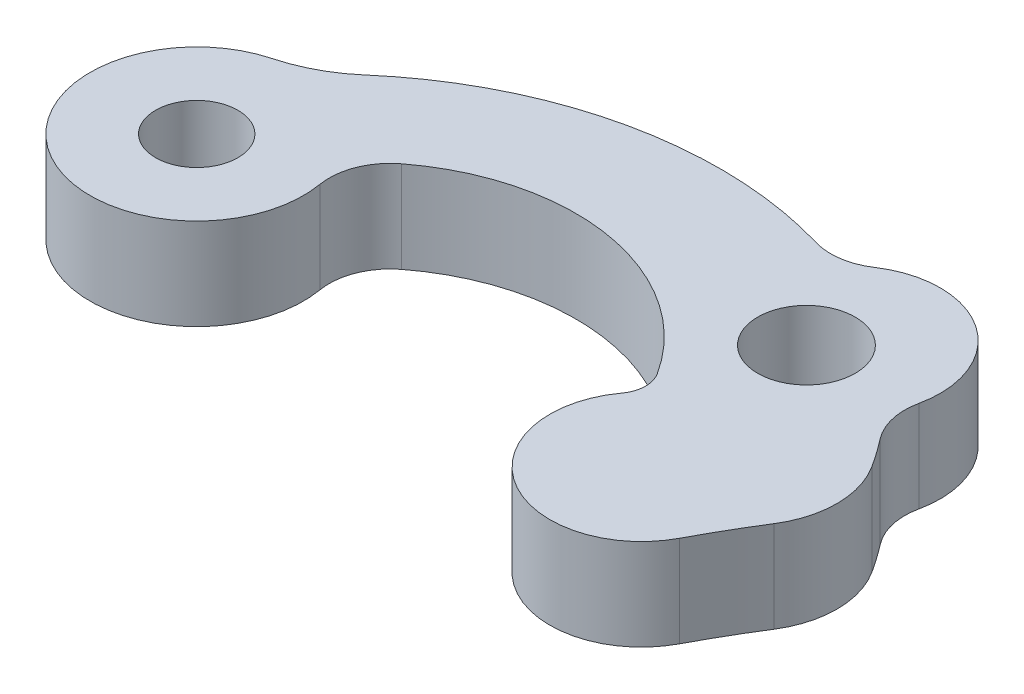
ISO-10303-21;
HEADER;
FILE_DESCRIPTION(('STEP AP214'),'2;1');
FILE_NAME('part.step','',(''),(''),'','','');
FILE_SCHEMA(('AUTOMOTIVE_DESIGN { 1 0 10303 214 1 1 1 1 }'));
ENDSEC;
DATA;
#1=APPLICATION_CONTEXT('core data for automotive mechanical design processes');
#2=APPLICATION_PROTOCOL_DEFINITION('international standard','automotive_design',2000,#1);
#3=PRODUCT_CONTEXT('',#1,'mechanical');
#4=PRODUCT('Part','Part','',(#3));
#5=PRODUCT_RELATED_PRODUCT_CATEGORY('part','',(#4));
#6=PRODUCT_DEFINITION_FORMATION('','',#4);
#7=PRODUCT_DEFINITION_CONTEXT('part definition',#1,'design');
#8=PRODUCT_DEFINITION('design','',#6,#7);
#9=PRODUCT_DEFINITION_SHAPE('','',#8);
#10=(LENGTH_UNIT() NAMED_UNIT(*) SI_UNIT(.MILLI.,.METRE.));
#11=(NAMED_UNIT(*) PLANE_ANGLE_UNIT() SI_UNIT($,.RADIAN.));
#12=(NAMED_UNIT(*) SI_UNIT($,.STERADIAN.) SOLID_ANGLE_UNIT());
#13=UNCERTAINTY_MEASURE_WITH_UNIT(LENGTH_MEASURE(1.E-05),#10,'distance_accuracy_value','');
#14=(GEOMETRIC_REPRESENTATION_CONTEXT(3) GLOBAL_UNCERTAINTY_ASSIGNED_CONTEXT((#13)) GLOBAL_UNIT_ASSIGNED_CONTEXT((#10,
#11,#12)) REPRESENTATION_CONTEXT('',''));
#15=CARTESIAN_POINT('',(0.,0.,0.));
#16=DIRECTION('',(0.,0.,1.));
#17=DIRECTION('',(1.,0.,0.));
#18=AXIS2_PLACEMENT_3D('',#15,#16,#17);
#19=CARTESIAN_POINT('',(9.58333333333333,3.,5.39997427977414));
#20=DIRECTION('',(0.,-1.,0.));
#21=DIRECTION('',(0.,0.,-1.));
#22=AXIS2_PLACEMENT_3D('',#19,#20,#21);
#23=CYLINDRICAL_SURFACE('',#22,13.);
#24=CARTESIAN_POINT('',(9.58333333333333,0.,5.39997427977414));
#25=DIRECTION('',(0.,1.,0.));
#26=DIRECTION('',(0.,0.,1.));
#27=AXIS2_PLACEMENT_3D('',#24,#25,#26);
#28=CIRCLE('',#27,13.);
#29=CARTESIAN_POINT('',(19.8692193431616,0.,-2.54990301442477));
#30=VERTEX_POINT('',#29);
#31=CARTESIAN_POINT('',(20.525,0.,-1.61999228393224));
#32=VERTEX_POINT('',#31);
#33=EDGE_CURVE('E287',#30,#32,#28,.F.);
#34=ORIENTED_EDGE('',*,*,#33,.F.);
#35=DIRECTION('',(0.,-1.,0.));
#36=VECTOR('',#35,1.);
#37=CARTESIAN_POINT('',(19.8692193431616,3.,-2.54990301442477));
#38=LINE('',#37,#36);
#39=CARTESIAN_POINT('',(19.8692193431616,3.,-2.54990301442477));
#40=VERTEX_POINT('',#39);
#41=EDGE_CURVE('E139',#30,#40,#38,.F.);
#42=ORIENTED_EDGE('',*,*,#41,.T.);
#43=CARTESIAN_POINT('',(9.58333333333333,3.,5.39997427977414));
#44=DIRECTION('',(0.,1.,0.));
#45=DIRECTION('',(0.,0.,1.));
#46=AXIS2_PLACEMENT_3D('',#43,#44,#45);
#47=CIRCLE('',#46,13.);
#48=CARTESIAN_POINT('',(20.525,3.,-1.61999228393224));
#49=VERTEX_POINT('',#48);
#50=EDGE_CURVE('E135',#40,#49,#47,.F.);
#51=ORIENTED_EDGE('',*,*,#50,.T.);
#52=DIRECTION('',(0.,-1.,0.));
#53=VECTOR('',#52,1.);
#54=CARTESIAN_POINT('',(20.525,3.,-1.61999228393224));
#55=LINE('',#54,#53);
#56=EDGE_CURVE('E138',#49,#32,#55,.T.);
#57=ORIENTED_EDGE('',*,*,#56,.T.);
#58=EDGE_LOOP('',(#34,#42,#51,#57));
#59=FACE_BOUND('',#58,.T.);
#60=ADVANCED_FACE('F41',(#59),#23,.T.);
#61=CARTESIAN_POINT('',(8.47222222222222,3.,3.03668414842308));
#62=DIRECTION('',(0.,-1.,0.));
#63=DIRECTION('',(0.,0.,-1.));
#64=AXIS2_PLACEMENT_3D('',#61,#62,#63);
#65=CYLINDRICAL_SURFACE('',#64,7.);
#66=CARTESIAN_POINT('',(8.47222222222222,0.,3.03668414842308));
#67=DIRECTION('',(0.,1.,0.));
#68=DIRECTION('',(0.,0.,1.));
#69=AXIS2_PLACEMENT_3D('',#66,#67,#68);
#70=CIRCLE('',#69,7.);
#71=CARTESIAN_POINT('',(4.20145579431538,0.,-2.50953565593591));
#72=VERTEX_POINT('',#71);
#73=CARTESIAN_POINT('',(14.3662242350737,0.,-0.73965538510701));
#74=VERTEX_POINT('',#73);
#75=EDGE_CURVE('E282',#72,#74,#70,.F.);
#76=ORIENTED_EDGE('',*,*,#75,.T.);
#77=DIRECTION('',(0.,-1.,0.));
#78=VECTOR('',#77,1.);
#79=CARTESIAN_POINT('',(14.3662242350737,3.,-0.739655385107009));
#80=LINE('',#79,#78);
#81=CARTESIAN_POINT('',(14.3662242350737,3.,-0.73965538510701));
#82=VERTEX_POINT('',#81);
#83=EDGE_CURVE('E176',#74,#82,#80,.F.);
#84=ORIENTED_EDGE('',*,*,#83,.T.);
#85=CARTESIAN_POINT('',(8.47222222222222,3.,3.03668414842308));
#86=DIRECTION('',(0.,1.,0.));
#87=DIRECTION('',(0.,0.,1.));
#88=AXIS2_PLACEMENT_3D('',#85,#86,#87);
#89=CIRCLE('',#88,7.);
#90=CARTESIAN_POINT('',(4.20145579431538,3.,-2.50953565593591));
#91=VERTEX_POINT('',#90);
#92=EDGE_CURVE('E273',#91,#82,#89,.F.);
#93=ORIENTED_EDGE('',*,*,#92,.F.);
#94=DIRECTION('',(0.,-1.,0.));
#95=VECTOR('',#94,1.);
#96=CARTESIAN_POINT('',(4.20145579431538,3.,-2.50953565593591));
#97=LINE('',#96,#95);
#98=EDGE_CURVE('E173',#91,#72,#97,.T.);
#99=ORIENTED_EDGE('',*,*,#98,.T.);
#100=EDGE_LOOP('',(#76,#84,#93,#99));
#101=FACE_BOUND('',#100,.T.);
#102=ADVANCED_FACE('F227',(#101),#65,.F.);
#103=CARTESIAN_POINT('',(16.75,3.,2.16506350946109));
#104=DIRECTION('',(0.,-1.,0.));
#105=DIRECTION('',(0.,0.,-1.));
#106=AXIS2_PLACEMENT_3D('',#103,#104,#105);
#107=CYLINDRICAL_SURFACE('',#106,3.);
#108=CARTESIAN_POINT('',(16.75,0.,2.16506350946109));
#109=DIRECTION('',(0.,1.,0.));
#110=DIRECTION('',(0.,0.,1.));
#111=AXIS2_PLACEMENT_3D('',#108,#109,#110);
#112=CIRCLE('',#111,3.);
#113=CARTESIAN_POINT('',(14.3306679606426,0.,0.391132145698954));
#114=VERTEX_POINT('',#113);
#115=CARTESIAN_POINT('',(19.4030298609084,0.,3.56557504355433));
#116=VERTEX_POINT('',#115);
#117=EDGE_CURVE('E285',#114,#116,#112,.T.);
#118=ORIENTED_EDGE('',*,*,#117,.T.);
#119=DIRECTION('',(0.,-1.,0.));
#120=VECTOR('',#119,1.);
#121=CARTESIAN_POINT('',(19.4030298609084,3.,3.56557504355433));
#122=LINE('',#121,#120);
#123=CARTESIAN_POINT('',(19.4030298609084,3.,3.56557504355433));
#124=VERTEX_POINT('',#123);
#125=EDGE_CURVE('E171',#116,#124,#122,.F.);
#126=ORIENTED_EDGE('',*,*,#125,.T.);
#127=CARTESIAN_POINT('',(16.75,3.,2.16506350946109));
#128=DIRECTION('',(0.,1.,0.));
#129=DIRECTION('',(0.,0.,1.));
#130=AXIS2_PLACEMENT_3D('',#127,#128,#129);
#131=CIRCLE('',#130,3.);
#132=CARTESIAN_POINT('',(14.3306679606426,3.,0.391132145698954));
#133=VERTEX_POINT('',#132);
#134=EDGE_CURVE('E154',#133,#124,#131,.T.);
#135=ORIENTED_EDGE('',*,*,#134,.F.);
#136=DIRECTION('',(0.,-1.,0.));
#137=VECTOR('',#136,1.);
#138=CARTESIAN_POINT('',(14.3306679606426,3.,0.391132145698954));
#139=LINE('',#138,#137);
#140=EDGE_CURVE('E162',#133,#114,#139,.T.);
#141=ORIENTED_EDGE('',*,*,#140,.T.);
#142=EDGE_LOOP('',(#118,#126,#135,#141));
#143=FACE_BOUND('',#142,.T.);
#144=ADVANCED_FACE('F233',(#143),#107,.T.);
#145=CARTESIAN_POINT('',(18.,3.,0.));
#146=DIRECTION('',(0.,-1.,0.));
#147=DIRECTION('',(0.,0.,-1.));
#148=AXIS2_PLACEMENT_3D('',#145,#146,#147);
#149=CYLINDRICAL_SURFACE('',#148,3.);
#150=CARTESIAN_POINT('',(18.,3.,0.));
#151=DIRECTION('',(0.,1.,0.));
#152=DIRECTION('',(0.,0.,1.));
#153=AXIS2_PLACEMENT_3D('',#150,#151,#152);
#154=CIRCLE('',#153,3.);
#155=CARTESIAN_POINT('',(20.5393934972721,3.,1.59733548949879));
#156=VERTEX_POINT('',#155);
#157=EDGE_CURVE('E142',#156,#49,#154,.T.);
#158=ORIENTED_EDGE('',*,*,#157,.F.);
#159=DIRECTION('',(0.,-1.,0.));
#160=VECTOR('',#159,1.);
#161=CARTESIAN_POINT('',(20.5393934972721,3.,1.59733548949879));
#162=LINE('',#161,#160);
#163=CARTESIAN_POINT('',(20.5393934972721,0.,1.59733548949879));
#164=VERTEX_POINT('',#163);
#165=EDGE_CURVE('E160',#156,#164,#162,.T.);
#166=ORIENTED_EDGE('',*,*,#165,.T.);
#167=CARTESIAN_POINT('',(18.,0.,0.));
#168=DIRECTION('',(0.,1.,0.));
#169=DIRECTION('',(0.,0.,1.));
#170=AXIS2_PLACEMENT_3D('',#167,#168,#169);
#171=CIRCLE('',#170,3.);
#172=EDGE_CURVE('E159',#164,#32,#171,.T.);
#173=ORIENTED_EDGE('',*,*,#172,.T.);
#174=ORIENTED_EDGE('',*,*,#56,.F.);
#175=EDGE_LOOP('',(#158,#166,#173,#174));
#176=FACE_BOUND('',#175,.T.);
#177=ADVANCED_FACE('F157',(#176),#149,.T.);
#178=CARTESIAN_POINT('',(0.,3.,0.));
#179=DIRECTION('',(0.,-1.,0.));
#180=DIRECTION('',(0.,0.,-1.));
#181=AXIS2_PLACEMENT_3D('',#178,#179,#180);
#182=CYLINDRICAL_SURFACE('',#181,1.35);
#183=CARTESIAN_POINT('',(0.,3.,0.));
#184=DIRECTION('',(0.,1.,0.));
#185=DIRECTION('',(0.,0.,1.));
#186=AXIS2_PLACEMENT_3D('',#183,#184,#185);
#187=CIRCLE('',#186,1.35);
#188=CARTESIAN_POINT('',(0.,3.,1.35));
#189=VERTEX_POINT('',#188);
#190=EDGE_CURVE('E270',#189,#189,#187,.T.);
#191=ORIENTED_EDGE('',*,*,#190,.T.);
#192=EDGE_LOOP('',(#191));
#193=FACE_BOUND('',#192,.T.);
#194=CARTESIAN_POINT('',(0.,0.,0.));
#195=DIRECTION('',(0.,1.,0.));
#196=DIRECTION('',(0.,0.,1.));
#197=AXIS2_PLACEMENT_3D('',#194,#195,#196);
#198=CIRCLE('',#197,1.35);
#199=CARTESIAN_POINT('',(0.,0.,1.35));
#200=VERTEX_POINT('',#199);
#201=EDGE_CURVE('E279',#200,#200,#198,.T.);
#202=ORIENTED_EDGE('',*,*,#201,.F.);
#203=EDGE_LOOP('',(#202));
#204=FACE_BOUND('',#203,.T.);
#205=ADVANCED_FACE('F247',(#193,#204),#182,.F.);
#206=CARTESIAN_POINT('',(16.,3.,-4.));
#207=DIRECTION('',(0.,-1.,0.));
#208=DIRECTION('',(0.,0.,-1.));
#209=AXIS2_PLACEMENT_3D('',#206,#207,#208);
#210=CYLINDRICAL_SURFACE('',#209,1.6);
#211=CARTESIAN_POINT('',(16.,3.,-4.));
#212=DIRECTION('',(0.,1.,0.));
#213=DIRECTION('',(0.,0.,1.));
#214=AXIS2_PLACEMENT_3D('',#211,#212,#213);
#215=CIRCLE('',#214,1.6);
#216=CARTESIAN_POINT('',(16.,3.,-2.4));
#217=VERTEX_POINT('',#216);
#218=EDGE_CURVE('E267',#217,#217,#215,.T.);
#219=ORIENTED_EDGE('',*,*,#218,.T.);
#220=EDGE_LOOP('',(#219));
#221=FACE_BOUND('',#220,.T.);
#222=CARTESIAN_POINT('',(16.,0.,-4.));
#223=DIRECTION('',(0.,1.,0.));
#224=DIRECTION('',(0.,0.,1.));
#225=AXIS2_PLACEMENT_3D('',#222,#223,#224);
#226=CIRCLE('',#225,1.6);
#227=CARTESIAN_POINT('',(16.,0.,-2.4));
#228=VERTEX_POINT('',#227);
#229=EDGE_CURVE('E265',#228,#228,#226,.T.);
#230=ORIENTED_EDGE('',*,*,#229,.F.);
#231=EDGE_LOOP('',(#230));
#232=FACE_BOUND('',#231,.T.);
#233=ADVANCED_FACE('F239',(#221,#232),#210,.F.);
#234=CARTESIAN_POINT('',(1.07705841033847,3.,-4.43075748009139));
#235=VERTEX_POINT('',#234);
#236=CARTESIAN_POINT('',(13.2400714875913,3.,-7.07513157433364));
#237=VERTEX_POINT('',#236);
#238=EDGE_CURVE('E141',#235,#237,#47,.F.);
#239=ORIENTED_EDGE('',*,*,#238,.T.);
#240=DIRECTION('',(0.,-1.,0.));
#241=VECTOR('',#240,1.);
#242=CARTESIAN_POINT('',(13.2400714875913,3.,-7.07513157433364));
#243=LINE('',#242,#241);
#244=CARTESIAN_POINT('',(13.2400714875913,0.,-7.07513157433364));
#245=VERTEX_POINT('',#244);
#246=EDGE_CURVE('E205',#237,#245,#243,.T.);
#247=ORIENTED_EDGE('',*,*,#246,.T.);
#248=CARTESIAN_POINT('',(1.07705841033847,0.,-4.43075748009139));
#249=VERTEX_POINT('',#248);
#250=EDGE_CURVE('E166',#249,#245,#28,.F.);
#251=ORIENTED_EDGE('',*,*,#250,.F.);
#252=DIRECTION('',(0.,-1.,0.));
#253=VECTOR('',#252,1.);
#254=CARTESIAN_POINT('',(1.07705841033847,3.,-4.43075748009139));
#255=LINE('',#254,#253);
#256=EDGE_CURVE('E183',#249,#235,#255,.F.);
#257=ORIENTED_EDGE('',*,*,#256,.T.);
#258=EDGE_LOOP('',(#239,#247,#251,#257));
#259=FACE_BOUND('',#258,.T.);
#260=ADVANCED_FACE('F229',(#259),#23,.T.);
#261=CARTESIAN_POINT('',(0.,3.,0.));
#262=DIRECTION('',(0.,1.,0.));
#263=DIRECTION('',(0.,0.,1.));
#264=AXIS2_PLACEMENT_3D('',#261,#262,#263);
#265=PLANE('',#264);
#266=ORIENTED_EDGE('',*,*,#238,.F.);
#267=CARTESIAN_POINT('',(-2.1945857908134,3.,-8.21180815696275));
#268=DIRECTION('',(0.,1.,0.));
#269=DIRECTION('',(0.,0.,1.));
#270=AXIS2_PLACEMENT_3D('',#267,#268,#269);
#271=CIRCLE('',#270,5.);
#272=CARTESIAN_POINT('',(-0.90365297268787,3.,-3.38133277051407));
#273=VERTEX_POINT('',#272);
#274=EDGE_CURVE('E198',#235,#273,#271,.F.);
#275=ORIENTED_EDGE('',*,*,#274,.T.);
#276=CARTESIAN_POINT('',(0.,3.,0.));
#277=DIRECTION('',(0.,1.,0.));
#278=DIRECTION('',(0.,0.,1.));
#279=AXIS2_PLACEMENT_3D('',#276,#277,#278);
#280=CIRCLE('',#279,3.5);
#281=CARTESIAN_POINT('',(3.45015667418376,3.,-0.588573634803035));
#282=VERTEX_POINT('',#281);
#283=EDGE_CURVE('E258',#273,#282,#280,.T.);
#284=ORIENTED_EDGE('',*,*,#283,.T.);
#285=CARTESIAN_POINT('',(5.42167477371734,3.,-0.924901426119055));
#286=DIRECTION('',(0.,1.,0.));
#287=DIRECTION('',(0.,0.,1.));
#288=AXIS2_PLACEMENT_3D('',#285,#286,#287);
#289=CIRCLE('',#288,2.);
#290=EDGE_CURVE('E194',#282,#91,#289,.F.);
#291=ORIENTED_EDGE('',*,*,#290,.T.);
#292=ORIENTED_EDGE('',*,*,#92,.T.);
#293=CARTESIAN_POINT('',(13.5242239475235,3.,-0.200178308888426));
#294=DIRECTION('',(0.,1.,0.));
#295=DIRECTION('',(0.,0.,1.));
#296=AXIS2_PLACEMENT_3D('',#293,#294,#295);
#297=CIRCLE('',#296,1.);
#298=EDGE_CURVE('E190',#82,#133,#297,.F.);
#299=ORIENTED_EDGE('',*,*,#298,.T.);
#300=ORIENTED_EDGE('',*,*,#134,.T.);
#301=CARTESIAN_POINT('',(45.9333284699927,3.,17.5706903844867));
#302=DIRECTION('',(0.,1.,0.));
#303=DIRECTION('',(0.,0.,1.));
#304=AXIS2_PLACEMENT_3D('',#301,#302,#303);
#305=CIRCLE('',#304,30.);
#306=EDGE_CURVE('E150',#124,#156,#305,.F.);
#307=ORIENTED_EDGE('',*,*,#306,.T.);
#308=ORIENTED_EDGE('',*,*,#157,.T.);
#309=ORIENTED_EDGE('',*,*,#50,.F.);
#310=CARTESIAN_POINT('',(21.4516633446736,3.,-3.77296105968614));
#311=DIRECTION('',(0.,1.,0.));
#312=DIRECTION('',(0.,0.,1.));
#313=AXIS2_PLACEMENT_3D('',#310,#311,#312);
#314=CIRCLE('',#313,2.);
#315=CARTESIAN_POINT('',(19.4965148816765,3.,-4.1941433095968));
#316=VERTEX_POINT('',#315);
#317=EDGE_CURVE('E49',#40,#316,#314,.F.);
#318=ORIENTED_EDGE('',*,*,#317,.T.);
#319=CARTESIAN_POINT('',(16.5637921871807,3.,-4.82591668446279));
#320=DIRECTION('',(0.,1.,0.));
#321=DIRECTION('',(0.,0.,1.));
#322=AXIS2_PLACEMENT_3D('',#319,#320,#321);
#323=CIRCLE('',#322,3.);
#324=CARTESIAN_POINT('',(14.9071048278201,3.,-7.32699385107217));
#325=VERTEX_POINT('',#324);
#326=EDGE_CURVE('E213',#316,#325,#323,.T.);
#327=ORIENTED_EDGE('',*,*,#326,.T.);
#328=CARTESIAN_POINT('',(13.8026465882464,3.,-8.99437862881175));
#329=DIRECTION('',(0.,1.,0.));
#330=DIRECTION('',(0.,0.,1.));
#331=AXIS2_PLACEMENT_3D('',#328,#329,#330);
#332=CIRCLE('',#331,2.);
#333=EDGE_CURVE('E208',#325,#237,#332,.F.);
#334=ORIENTED_EDGE('',*,*,#333,.T.);
#335=EDGE_LOOP('',(#266,#275,#284,#291,#292,#299,#300,#307,#308,#309,#318,#327,#334));
#336=FACE_BOUND('',#335,.T.);
#337=ORIENTED_EDGE('',*,*,#218,.F.);
#338=EDGE_LOOP('',(#337));
#339=FACE_BOUND('',#338,.T.);
#340=ORIENTED_EDGE('',*,*,#190,.F.);
#341=EDGE_LOOP('',(#340));
#342=FACE_BOUND('',#341,.T.);
#343=ADVANCED_FACE('F146',(#336,#339,#342),#265,.T.);
#344=CARTESIAN_POINT('',(0.,0.,0.));
#345=DIRECTION('',(0.,1.,0.));
#346=DIRECTION('',(0.,0.,1.));
#347=AXIS2_PLACEMENT_3D('',#344,#345,#346);
#348=PLANE('',#347);
#349=ORIENTED_EDGE('',*,*,#75,.F.);
#350=CARTESIAN_POINT('',(5.42167477371734,0.,-0.924901426119055));
#351=DIRECTION('',(0.,1.,0.));
#352=DIRECTION('',(0.,0.,1.));
#353=AXIS2_PLACEMENT_3D('',#350,#351,#352);
#354=CIRCLE('',#353,2.);
#355=CARTESIAN_POINT('',(3.45015667418376,0.,-0.588573634803035));
#356=VERTEX_POINT('',#355);
#357=EDGE_CURVE('E192',#72,#356,#354,.T.);
#358=ORIENTED_EDGE('',*,*,#357,.T.);
#359=CARTESIAN_POINT('',(0.,0.,0.));
#360=DIRECTION('',(0.,1.,0.));
#361=DIRECTION('',(0.,0.,1.));
#362=AXIS2_PLACEMENT_3D('',#359,#360,#361);
#363=CIRCLE('',#362,3.5);
#364=CARTESIAN_POINT('',(-0.90365297268787,0.,-3.38133277051407));
#365=VERTEX_POINT('',#364);
#366=EDGE_CURVE('E261',#365,#356,#363,.T.);
#367=ORIENTED_EDGE('',*,*,#366,.F.);
#368=CARTESIAN_POINT('',(-2.1945857908134,0.,-8.21180815696275));
#369=DIRECTION('',(0.,1.,0.));
#370=DIRECTION('',(0.,0.,1.));
#371=AXIS2_PLACEMENT_3D('',#368,#369,#370);
#372=CIRCLE('',#371,5.);
#373=EDGE_CURVE('E196',#365,#249,#372,.T.);
#374=ORIENTED_EDGE('',*,*,#373,.T.);
#375=ORIENTED_EDGE('',*,*,#250,.T.);
#376=CARTESIAN_POINT('',(13.8026465882464,0.,-8.99437862881175));
#377=DIRECTION('',(0.,1.,0.));
#378=DIRECTION('',(0.,0.,1.));
#379=AXIS2_PLACEMENT_3D('',#376,#377,#378);
#380=CIRCLE('',#379,2.);
#381=CARTESIAN_POINT('',(14.9071048278201,0.,-7.32699385107217));
#382=VERTEX_POINT('',#381);
#383=EDGE_CURVE('E210',#245,#382,#380,.T.);
#384=ORIENTED_EDGE('',*,*,#383,.T.);
#385=CARTESIAN_POINT('',(16.5637921871807,0.,-4.82591668446279));
#386=DIRECTION('',(0.,1.,0.));
#387=DIRECTION('',(0.,0.,1.));
#388=AXIS2_PLACEMENT_3D('',#385,#386,#387);
#389=CIRCLE('',#388,3.);
#390=CARTESIAN_POINT('',(19.4965148816765,0.,-4.1941433095968));
#391=VERTEX_POINT('',#390);
#392=EDGE_CURVE('E218',#382,#391,#389,.F.);
#393=ORIENTED_EDGE('',*,*,#392,.T.);
#394=CARTESIAN_POINT('',(21.4516633446736,0.,-3.77296105968614));
#395=DIRECTION('',(0.,1.,0.));
#396=DIRECTION('',(0.,0.,1.));
#397=AXIS2_PLACEMENT_3D('',#394,#395,#396);
#398=CIRCLE('',#397,2.);
#399=EDGE_CURVE('E12',#391,#30,#398,.T.);
#400=ORIENTED_EDGE('',*,*,#399,.T.);
#401=ORIENTED_EDGE('',*,*,#33,.T.);
#402=ORIENTED_EDGE('',*,*,#172,.F.);
#403=CARTESIAN_POINT('',(45.9333284699927,0.,17.5706903844867));
#404=DIRECTION('',(0.,1.,0.));
#405=DIRECTION('',(0.,0.,1.));
#406=AXIS2_PLACEMENT_3D('',#403,#404,#405);
#407=CIRCLE('',#406,30.);
#408=EDGE_CURVE('E185',#164,#116,#407,.T.);
#409=ORIENTED_EDGE('',*,*,#408,.T.);
#410=ORIENTED_EDGE('',*,*,#117,.F.);
#411=CARTESIAN_POINT('',(13.5242239475235,0.,-0.200178308888426));
#412=DIRECTION('',(0.,1.,0.));
#413=DIRECTION('',(0.,0.,1.));
#414=AXIS2_PLACEMENT_3D('',#411,#412,#413);
#415=CIRCLE('',#414,1.);
#416=EDGE_CURVE('E188',#114,#74,#415,.T.);
#417=ORIENTED_EDGE('',*,*,#416,.T.);
#418=EDGE_LOOP('',(#349,#358,#367,#374,#375,#384,#393,#400,#401,#402,#409,#410,#417));
#419=FACE_BOUND('',#418,.T.);
#420=ORIENTED_EDGE('',*,*,#229,.T.);
#421=EDGE_LOOP('',(#420));
#422=FACE_BOUND('',#421,.T.);
#423=ORIENTED_EDGE('',*,*,#201,.T.);
#424=EDGE_LOOP('',(#423));
#425=FACE_BOUND('',#424,.T.);
#426=ADVANCED_FACE('F245',(#419,#422,#425),#348,.F.);
#427=CARTESIAN_POINT('',(0.,0.,0.));
#428=DIRECTION('',(0.,1.,0.));
#429=DIRECTION('',(0.,0.,1.));
#430=AXIS2_PLACEMENT_3D('',#427,#428,#429);
#431=CYLINDRICAL_SURFACE('',#430,3.5);
#432=ORIENTED_EDGE('',*,*,#366,.T.);
#433=DIRECTION('',(0.,1.,0.));
#434=VECTOR('',#433,1.);
#435=CARTESIAN_POINT('',(3.45015667418376,0.,-0.588573634803035));
#436=LINE('',#435,#434);
#437=EDGE_CURVE('E181',#356,#282,#436,.T.);
#438=ORIENTED_EDGE('',*,*,#437,.T.);
#439=ORIENTED_EDGE('',*,*,#283,.F.);
#440=DIRECTION('',(0.,1.,0.));
#441=VECTOR('',#440,1.);
#442=CARTESIAN_POINT('',(-0.90365297268787,0.,-3.38133277051407));
#443=LINE('',#442,#441);
#444=EDGE_CURVE('E178',#273,#365,#443,.F.);
#445=ORIENTED_EDGE('',*,*,#444,.T.);
#446=EDGE_LOOP('',(#432,#438,#439,#445));
#447=FACE_BOUND('',#446,.T.);
#448=ADVANCED_FACE('F297',(#447),#431,.T.);
#449=CARTESIAN_POINT('',(45.9333284699927,3.,17.5706903844867));
#450=DIRECTION('',(0.,1.,0.));
#451=DIRECTION('',(0.,0.,1.));
#452=AXIS2_PLACEMENT_3D('',#449,#450,#451);
#453=CYLINDRICAL_SURFACE('',#452,30.);
#454=ORIENTED_EDGE('',*,*,#306,.F.);
#455=ORIENTED_EDGE('',*,*,#125,.F.);
#456=ORIENTED_EDGE('',*,*,#408,.F.);
#457=ORIENTED_EDGE('',*,*,#165,.F.);
#458=EDGE_LOOP('',(#454,#455,#456,#457));
#459=FACE_BOUND('',#458,.T.);
#460=ADVANCED_FACE('F294',(#459),#453,.F.);
#461=CARTESIAN_POINT('',(13.5242239475235,3.,-0.200178308888426));
#462=DIRECTION('',(0.,-1.,0.));
#463=DIRECTION('',(0.,0.,-1.));
#464=AXIS2_PLACEMENT_3D('',#461,#462,#463);
#465=CYLINDRICAL_SURFACE('',#464,1.);
#466=ORIENTED_EDGE('',*,*,#298,.F.);
#467=ORIENTED_EDGE('',*,*,#83,.F.);
#468=ORIENTED_EDGE('',*,*,#416,.F.);
#469=ORIENTED_EDGE('',*,*,#140,.F.);
#470=EDGE_LOOP('',(#466,#467,#468,#469));
#471=FACE_BOUND('',#470,.T.);
#472=ADVANCED_FACE('F296',(#471),#465,.F.);
#473=CARTESIAN_POINT('',(5.42167477371734,0.,-0.924901426119055));
#474=DIRECTION('',(0.,-1.,0.));
#475=DIRECTION('',(0.,0.,-1.));
#476=AXIS2_PLACEMENT_3D('',#473,#474,#475);
#477=CYLINDRICAL_SURFACE('',#476,2.);
#478=ORIENTED_EDGE('',*,*,#290,.F.);
#479=ORIENTED_EDGE('',*,*,#437,.F.);
#480=ORIENTED_EDGE('',*,*,#357,.F.);
#481=ORIENTED_EDGE('',*,*,#98,.F.);
#482=EDGE_LOOP('',(#478,#479,#480,#481));
#483=FACE_BOUND('',#482,.T.);
#484=ADVANCED_FACE('F303',(#483),#477,.F.);
#485=CARTESIAN_POINT('',(-2.1945857908134,3.,-8.21180815696275));
#486=DIRECTION('',(0.,1.,0.));
#487=DIRECTION('',(0.,0.,1.));
#488=AXIS2_PLACEMENT_3D('',#485,#486,#487);
#489=CYLINDRICAL_SURFACE('',#488,5.);
#490=ORIENTED_EDGE('',*,*,#274,.F.);
#491=ORIENTED_EDGE('',*,*,#256,.F.);
#492=ORIENTED_EDGE('',*,*,#373,.F.);
#493=ORIENTED_EDGE('',*,*,#444,.F.);
#494=EDGE_LOOP('',(#490,#491,#492,#493));
#495=FACE_BOUND('',#494,.T.);
#496=ADVANCED_FACE('F312',(#495),#489,.F.);
#497=CARTESIAN_POINT('',(16.5637921871807,-6.93890842292127,-4.82591668446279));
#498=DIRECTION('',(0.,1.,0.));
#499=DIRECTION('',(0.,0.,1.));
#500=AXIS2_PLACEMENT_3D('',#497,#498,#499);
#501=CYLINDRICAL_SURFACE('',#500,3.);
#502=ORIENTED_EDGE('',*,*,#392,.F.);
#503=DIRECTION('',(0.,1.,0.));
#504=VECTOR('',#503,1.);
#505=CARTESIAN_POINT('',(14.9071048278201,-6.93890842292127,-7.32699385107217));
#506=LINE('',#505,#504);
#507=EDGE_CURVE('E202',#382,#325,#506,.T.);
#508=ORIENTED_EDGE('',*,*,#507,.T.);
#509=ORIENTED_EDGE('',*,*,#326,.F.);
#510=DIRECTION('',(0.,1.,0.));
#511=VECTOR('',#510,1.);
#512=CARTESIAN_POINT('',(19.4965148816765,-6.93890842292127,-4.1941433095968));
#513=LINE('',#512,#511);
#514=EDGE_CURVE('E200',#316,#391,#513,.F.);
#515=ORIENTED_EDGE('',*,*,#514,.T.);
#516=EDGE_LOOP('',(#502,#508,#509,#515));
#517=FACE_BOUND('',#516,.T.);
#518=ADVANCED_FACE('F216',(#517),#501,.T.);
#519=CARTESIAN_POINT('',(13.8026465882464,3.,-8.99437862881175));
#520=DIRECTION('',(0.,-1.,0.));
#521=DIRECTION('',(0.,0.,-1.));
#522=AXIS2_PLACEMENT_3D('',#519,#520,#521);
#523=CYLINDRICAL_SURFACE('',#522,2.);
#524=ORIENTED_EDGE('',*,*,#383,.F.);
#525=ORIENTED_EDGE('',*,*,#246,.F.);
#526=ORIENTED_EDGE('',*,*,#333,.F.);
#527=ORIENTED_EDGE('',*,*,#507,.F.);
#528=EDGE_LOOP('',(#524,#525,#526,#527));
#529=FACE_BOUND('',#528,.T.);
#530=ADVANCED_FACE('F221',(#529),#523,.F.);
#531=CARTESIAN_POINT('',(21.4516633446736,-6.93890842292127,-3.77296105968614));
#532=DIRECTION('',(0.,-1.,0.));
#533=DIRECTION('',(0.,0.,-1.));
#534=AXIS2_PLACEMENT_3D('',#531,#532,#533);
#535=CYLINDRICAL_SURFACE('',#534,2.);
#536=ORIENTED_EDGE('',*,*,#399,.F.);
#537=ORIENTED_EDGE('',*,*,#514,.F.);
#538=ORIENTED_EDGE('',*,*,#317,.F.);
#539=ORIENTED_EDGE('',*,*,#41,.F.);
#540=EDGE_LOOP('',(#536,#537,#538,#539));
#541=FACE_BOUND('',#540,.T.);
#542=ADVANCED_FACE('F43',(#541),#535,.F.);
#543=CLOSED_SHELL('',(#60,#102,#144,#177,#205,#233,#260,#343,#426,#448,#460,#472,#484,#496,#518,
#530,#542));
#544=MANIFOLD_SOLID_BREP('B2',#543);
#545=ADVANCED_BREP_SHAPE_REPRESENTATION('',(#18,#544),#14);
#546=SHAPE_DEFINITION_REPRESENTATION(#9,#545);
ENDSEC;
END-ISO-10303-21;
